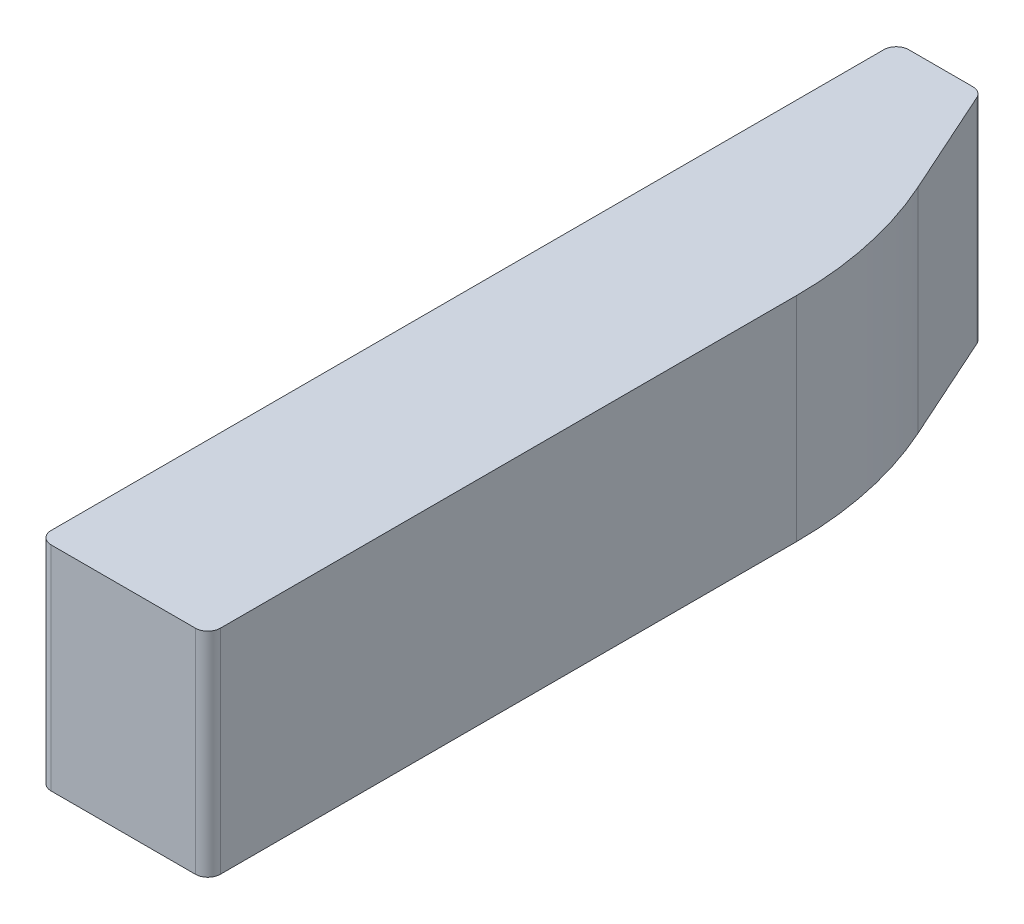
ISO-10303-21;
HEADER;
FILE_DESCRIPTION(('STEP AP214'),'2;1');
FILE_NAME('part.step','',(''),(''),'','','');
FILE_SCHEMA(('AUTOMOTIVE_DESIGN { 1 0 10303 214 1 1 1 1 }'));
ENDSEC;
DATA;
#1=APPLICATION_CONTEXT('core data for automotive mechanical design processes');
#2=APPLICATION_PROTOCOL_DEFINITION('international standard','automotive_design',2000,#1);
#3=PRODUCT_CONTEXT('',#1,'mechanical');
#4=PRODUCT('Part','Part','',(#3));
#5=PRODUCT_RELATED_PRODUCT_CATEGORY('part','',(#4));
#6=PRODUCT_DEFINITION_FORMATION('','',#4);
#7=PRODUCT_DEFINITION_CONTEXT('part definition',#1,'design');
#8=PRODUCT_DEFINITION('design','',#6,#7);
#9=PRODUCT_DEFINITION_SHAPE('','',#8);
#10=(LENGTH_UNIT() NAMED_UNIT(*) SI_UNIT(.MILLI.,.METRE.));
#11=(NAMED_UNIT(*) PLANE_ANGLE_UNIT() SI_UNIT($,.RADIAN.));
#12=(NAMED_UNIT(*) SI_UNIT($,.STERADIAN.) SOLID_ANGLE_UNIT());
#13=UNCERTAINTY_MEASURE_WITH_UNIT(LENGTH_MEASURE(1.E-05),#10,'distance_accuracy_value','');
#14=(GEOMETRIC_REPRESENTATION_CONTEXT(3) GLOBAL_UNCERTAINTY_ASSIGNED_CONTEXT((#13)) GLOBAL_UNIT_ASSIGNED_CONTEXT((#10,
#11,#12)) REPRESENTATION_CONTEXT('',''));
#15=CARTESIAN_POINT('',(0.,0.,0.));
#16=DIRECTION('',(0.,0.,1.));
#17=DIRECTION('',(1.,0.,0.));
#18=AXIS2_PLACEMENT_3D('',#15,#16,#17);
#19=CARTESIAN_POINT('',(-20.,17.,0.));
#20=DIRECTION('',(-1.,0.,0.));
#21=DIRECTION('',(0.,0.,-1.));
#22=AXIS2_PLACEMENT_3D('',#19,#20,#21);
#23=PLANE('',#22);
#24=DIRECTION('',(0.,0.,1.));
#25=VECTOR('',#24,1.);
#26=CARTESIAN_POINT('',(-20.,0.,0.));
#27=LINE('',#26,#25);
#28=CARTESIAN_POINT('',(-20.,0.,-46.960959335129));
#29=VERTEX_POINT('',#28);
#30=CARTESIAN_POINT('',(-20.,0.,-1.));
#31=VERTEX_POINT('',#30);
#32=EDGE_CURVE('E186',#29,#31,#27,.T.);
#33=ORIENTED_EDGE('',*,*,#32,.F.);
#34=DIRECTION('',(0.,1.,0.));
#35=VECTOR('',#34,1.);
#36=CARTESIAN_POINT('',(-20.,17.,-46.960959335129));
#37=LINE('',#36,#35);
#38=CARTESIAN_POINT('',(-20.,17.,-46.960959335129));
#39=VERTEX_POINT('',#38);
#40=EDGE_CURVE('E132',#39,#29,#37,.F.);
#41=ORIENTED_EDGE('',*,*,#40,.F.);
#42=DIRECTION('',(0.,0.,1.));
#43=VECTOR('',#42,1.);
#44=CARTESIAN_POINT('',(-20.,17.,0.));
#45=LINE('',#44,#43);
#46=CARTESIAN_POINT('',(-20.,17.,-1.));
#47=VERTEX_POINT('',#46);
#48=EDGE_CURVE('E130',#39,#47,#45,.T.);
#49=ORIENTED_EDGE('',*,*,#48,.T.);
#50=DIRECTION('',(0.,-1.,0.));
#51=VECTOR('',#50,1.);
#52=CARTESIAN_POINT('',(-20.,17.,-1.));
#53=LINE('',#52,#51);
#54=EDGE_CURVE('E152',#31,#47,#53,.F.);
#55=ORIENTED_EDGE('',*,*,#54,.F.);
#56=EDGE_LOOP('',(#33,#41,#49,#55));
#57=FACE_BOUND('',#56,.T.);
#58=ADVANCED_FACE('F33',(#57),#23,.F.);
#59=CARTESIAN_POINT('',(-20.,17.,0.));
#60=DIRECTION('',(0.,0.,-1.));
#61=DIRECTION('',(1.,0.,0.));
#62=AXIS2_PLACEMENT_3D('',#59,#60,#61);
#63=PLANE('',#62);
#64=DIRECTION('',(-1.,0.,0.));
#65=VECTOR('',#64,1.);
#66=CARTESIAN_POINT('',(-20.,17.,0.));
#67=LINE('',#66,#65);
#68=CARTESIAN_POINT('',(-21.,17.,0.));
#69=VERTEX_POINT('',#68);
#70=CARTESIAN_POINT('',(-32.5,17.,0.));
#71=VERTEX_POINT('',#70);
#72=EDGE_CURVE('E179',#69,#71,#67,.T.);
#73=ORIENTED_EDGE('',*,*,#72,.T.);
#74=DIRECTION('',(0.,-1.,0.));
#75=VECTOR('',#74,1.);
#76=CARTESIAN_POINT('',(-32.5,17.,0.));
#77=LINE('',#76,#75);
#78=CARTESIAN_POINT('',(-32.5,0.,0.));
#79=VERTEX_POINT('',#78);
#80=EDGE_CURVE('E138',#79,#71,#77,.F.);
#81=ORIENTED_EDGE('',*,*,#80,.F.);
#82=DIRECTION('',(-1.,0.,0.));
#83=VECTOR('',#82,1.);
#84=CARTESIAN_POINT('',(-20.,0.,0.));
#85=LINE('',#84,#83);
#86=CARTESIAN_POINT('',(-21.,0.,0.));
#87=VERTEX_POINT('',#86);
#88=EDGE_CURVE('E181',#87,#79,#85,.T.);
#89=ORIENTED_EDGE('',*,*,#88,.F.);
#90=DIRECTION('',(0.,-1.,0.));
#91=VECTOR('',#90,1.);
#92=CARTESIAN_POINT('',(-21.,17.,0.));
#93=LINE('',#92,#91);
#94=EDGE_CURVE('E141',#69,#87,#93,.T.);
#95=ORIENTED_EDGE('',*,*,#94,.F.);
#96=EDGE_LOOP('',(#73,#81,#89,#95));
#97=FACE_BOUND('',#96,.T.);
#98=ADVANCED_FACE('F222',(#97),#63,.F.);
#99=CARTESIAN_POINT('',(-33.5,17.,0.));
#100=DIRECTION('',(1.,0.,0.));
#101=DIRECTION('',(0.,0.,1.));
#102=AXIS2_PLACEMENT_3D('',#99,#100,#101);
#103=PLANE('',#102);
#104=DIRECTION('',(0.,0.,-1.));
#105=VECTOR('',#104,1.);
#106=CARTESIAN_POINT('',(-33.5,17.,0.));
#107=LINE('',#106,#105);
#108=CARTESIAN_POINT('',(-33.5,17.,-1.));
#109=VERTEX_POINT('',#108);
#110=CARTESIAN_POINT('',(-33.5,17.,-67.4));
#111=VERTEX_POINT('',#110);
#112=EDGE_CURVE('E191',#109,#111,#107,.T.);
#113=ORIENTED_EDGE('',*,*,#112,.T.);
#114=DIRECTION('',(0.,-1.,0.));
#115=VECTOR('',#114,1.);
#116=CARTESIAN_POINT('',(-33.5,17.,-67.4));
#117=LINE('',#116,#115);
#118=CARTESIAN_POINT('',(-33.5,0.,-67.4));
#119=VERTEX_POINT('',#118);
#120=EDGE_CURVE('E161',#119,#111,#117,.F.);
#121=ORIENTED_EDGE('',*,*,#120,.F.);
#122=DIRECTION('',(0.,0.,-1.));
#123=VECTOR('',#122,1.);
#124=CARTESIAN_POINT('',(-33.5,0.,0.));
#125=LINE('',#124,#123);
#126=CARTESIAN_POINT('',(-33.5,0.,-1.));
#127=VERTEX_POINT('',#126);
#128=EDGE_CURVE('E178',#127,#119,#125,.T.);
#129=ORIENTED_EDGE('',*,*,#128,.F.);
#130=DIRECTION('',(0.,-1.,0.));
#131=VECTOR('',#130,1.);
#132=CARTESIAN_POINT('',(-33.5,17.,-1.));
#133=LINE('',#132,#131);
#134=EDGE_CURVE('E163',#109,#127,#133,.T.);
#135=ORIENTED_EDGE('',*,*,#134,.F.);
#136=EDGE_LOOP('',(#113,#121,#129,#135));
#137=FACE_BOUND('',#136,.T.);
#138=ADVANCED_FACE('F215',(#137),#103,.F.);
#139=CARTESIAN_POINT('',(-20.,17.,-68.4));
#140=DIRECTION('',(0.,0.,1.));
#141=DIRECTION('',(-1.,0.,0.));
#142=AXIS2_PLACEMENT_3D('',#139,#140,#141);
#143=PLANE('',#142);
#144=DIRECTION('',(1.,0.,0.));
#145=VECTOR('',#144,1.);
#146=CARTESIAN_POINT('',(-20.,17.,-68.4));
#147=LINE('',#146,#145);
#148=CARTESIAN_POINT('',(-32.5,17.,-68.4));
#149=VERTEX_POINT('',#148);
#150=CARTESIAN_POINT('',(-27.3965856099731,17.,-68.4));
#151=VERTEX_POINT('',#150);
#152=EDGE_CURVE('E122',#149,#151,#147,.T.);
#153=ORIENTED_EDGE('',*,*,#152,.T.);
#154=DIRECTION('',(0.,1.,0.));
#155=VECTOR('',#154,1.);
#156=CARTESIAN_POINT('',(-27.3965856099731,17.,-68.4));
#157=LINE('',#156,#155);
#158=CARTESIAN_POINT('',(-27.3965856099731,0.,-68.4));
#159=VERTEX_POINT('',#158);
#160=EDGE_CURVE('E166',#159,#151,#157,.T.);
#161=ORIENTED_EDGE('',*,*,#160,.F.);
#162=DIRECTION('',(1.,0.,0.));
#163=VECTOR('',#162,1.);
#164=CARTESIAN_POINT('',(-20.,0.,-68.4));
#165=LINE('',#164,#163);
#166=CARTESIAN_POINT('',(-32.5,0.,-68.4));
#167=VERTEX_POINT('',#166);
#168=EDGE_CURVE('E174',#167,#159,#165,.T.);
#169=ORIENTED_EDGE('',*,*,#168,.F.);
#170=DIRECTION('',(0.,-1.,0.));
#171=VECTOR('',#170,1.);
#172=CARTESIAN_POINT('',(-32.5,17.,-68.4));
#173=LINE('',#172,#171);
#174=EDGE_CURVE('E41',#149,#167,#173,.T.);
#175=ORIENTED_EDGE('',*,*,#174,.F.);
#176=EDGE_LOOP('',(#153,#161,#169,#175));
#177=FACE_BOUND('',#176,.T.);
#178=ADVANCED_FACE('F175',(#177),#143,.F.);
#179=CARTESIAN_POINT('',(-20.,17.,0.));
#180=DIRECTION('',(0.,-1.,0.));
#181=DIRECTION('',(0.,0.,-1.));
#182=AXIS2_PLACEMENT_3D('',#179,#180,#181);
#183=PLANE('',#182);
#184=ORIENTED_EDGE('',*,*,#48,.F.);
#185=CARTESIAN_POINT('',(-50.,17.,-46.960959335129));
#186=DIRECTION('',(0.,1.,0.));
#187=DIRECTION('',(0.,0.,-1.));
#188=AXIS2_PLACEMENT_3D('',#185,#186,#187);
#189=CIRCLE('',#188,30.);
#190=CARTESIAN_POINT('',(-22.6423548447468,17.,-59.2718996549929));
#191=VERTEX_POINT('',#190);
#192=EDGE_CURVE('E116',#191,#39,#189,.F.);
#193=ORIENTED_EDGE('',*,*,#192,.F.);
#194=DIRECTION('',(-0.410364677328798,0.,-0.911921505175107));
#195=VECTOR('',#194,1.);
#196=CARTESIAN_POINT('',(-20.,17.,-53.4));
#197=LINE('',#196,#195);
#198=CARTESIAN_POINT('',(-26.484664104798,17.,-67.8103646773288));
#199=VERTEX_POINT('',#198);
#200=EDGE_CURVE('E124',#191,#199,#197,.T.);
#201=ORIENTED_EDGE('',*,*,#200,.T.);
#202=CARTESIAN_POINT('',(-27.3965856099731,17.,-67.4));
#203=DIRECTION('',(0.,1.,0.));
#204=DIRECTION('',(0.,0.,-1.));
#205=AXIS2_PLACEMENT_3D('',#202,#203,#204);
#206=CIRCLE('',#205,1.);
#207=EDGE_CURVE('E48',#151,#199,#206,.F.);
#208=ORIENTED_EDGE('',*,*,#207,.F.);
#209=ORIENTED_EDGE('',*,*,#152,.F.);
#210=CARTESIAN_POINT('',(-32.5,17.,-67.4));
#211=DIRECTION('',(0.,1.,0.));
#212=DIRECTION('',(0.,0.,-1.));
#213=AXIS2_PLACEMENT_3D('',#210,#211,#212);
#214=CIRCLE('',#213,1.);
#215=EDGE_CURVE('E56',#111,#149,#214,.F.);
#216=ORIENTED_EDGE('',*,*,#215,.F.);
#217=ORIENTED_EDGE('',*,*,#112,.F.);
#218=CARTESIAN_POINT('',(-32.5,17.,-1.));
#219=DIRECTION('',(0.,1.,0.));
#220=DIRECTION('',(0.,0.,-1.));
#221=AXIS2_PLACEMENT_3D('',#218,#219,#220);
#222=CIRCLE('',#221,1.);
#223=EDGE_CURVE('E157',#71,#109,#222,.F.);
#224=ORIENTED_EDGE('',*,*,#223,.F.);
#225=ORIENTED_EDGE('',*,*,#72,.F.);
#226=CARTESIAN_POINT('',(-21.,17.,-1.));
#227=DIRECTION('',(0.,1.,0.));
#228=DIRECTION('',(0.,0.,-1.));
#229=AXIS2_PLACEMENT_3D('',#226,#227,#228);
#230=CIRCLE('',#229,1.);
#231=EDGE_CURVE('E159',#47,#69,#230,.F.);
#232=ORIENTED_EDGE('',*,*,#231,.F.);
#233=EDGE_LOOP('',(#184,#193,#201,#208,#209,#216,#217,#224,#225,#232));
#234=FACE_BOUND('',#233,.T.);
#235=ADVANCED_FACE('F128',(#234),#183,.F.);
#236=CARTESIAN_POINT('',(-20.,0.,0.));
#237=DIRECTION('',(0.,-1.,0.));
#238=DIRECTION('',(0.,0.,-1.));
#239=AXIS2_PLACEMENT_3D('',#236,#237,#238);
#240=PLANE('',#239);
#241=ORIENTED_EDGE('',*,*,#88,.T.);
#242=CARTESIAN_POINT('',(-32.5,0.,-1.));
#243=DIRECTION('',(0.,1.,0.));
#244=DIRECTION('',(0.,0.,-1.));
#245=AXIS2_PLACEMENT_3D('',#242,#243,#244);
#246=CIRCLE('',#245,1.);
#247=EDGE_CURVE('E148',#127,#79,#246,.T.);
#248=ORIENTED_EDGE('',*,*,#247,.F.);
#249=ORIENTED_EDGE('',*,*,#128,.T.);
#250=CARTESIAN_POINT('',(-32.5,0.,-67.4));
#251=DIRECTION('',(0.,1.,0.));
#252=DIRECTION('',(0.,0.,-1.));
#253=AXIS2_PLACEMENT_3D('',#250,#251,#252);
#254=CIRCLE('',#253,1.);
#255=EDGE_CURVE('E146',#167,#119,#254,.T.);
#256=ORIENTED_EDGE('',*,*,#255,.F.);
#257=ORIENTED_EDGE('',*,*,#168,.T.);
#258=CARTESIAN_POINT('',(-27.3965856099731,0.,-67.4));
#259=DIRECTION('',(0.,1.,0.));
#260=DIRECTION('',(0.,0.,-1.));
#261=AXIS2_PLACEMENT_3D('',#258,#259,#260);
#262=CIRCLE('',#261,1.);
#263=CARTESIAN_POINT('',(-26.484664104798,0.,-67.8103646773288));
#264=VERTEX_POINT('',#263);
#265=EDGE_CURVE('E144',#264,#159,#262,.T.);
#266=ORIENTED_EDGE('',*,*,#265,.F.);
#267=DIRECTION('',(-0.410364677328798,0.,-0.911921505175107));
#268=VECTOR('',#267,1.);
#269=CARTESIAN_POINT('',(-20.,0.,-53.4));
#270=LINE('',#269,#268);
#271=CARTESIAN_POINT('',(-22.6423548447468,0.,-59.2718996549929));
#272=VERTEX_POINT('',#271);
#273=EDGE_CURVE('E126',#272,#264,#270,.T.);
#274=ORIENTED_EDGE('',*,*,#273,.F.);
#275=CARTESIAN_POINT('',(-50.,0.,-46.960959335129));
#276=DIRECTION('',(0.,1.,0.));
#277=DIRECTION('',(0.,0.,-1.));
#278=AXIS2_PLACEMENT_3D('',#275,#276,#277);
#279=CIRCLE('',#278,30.);
#280=EDGE_CURVE('E118',#29,#272,#279,.T.);
#281=ORIENTED_EDGE('',*,*,#280,.F.);
#282=ORIENTED_EDGE('',*,*,#32,.T.);
#283=CARTESIAN_POINT('',(-21.,0.,-1.));
#284=DIRECTION('',(0.,1.,0.));
#285=DIRECTION('',(0.,0.,-1.));
#286=AXIS2_PLACEMENT_3D('',#283,#284,#285);
#287=CIRCLE('',#286,1.);
#288=EDGE_CURVE('E150',#87,#31,#287,.T.);
#289=ORIENTED_EDGE('',*,*,#288,.F.);
#290=EDGE_LOOP('',(#241,#248,#249,#256,#257,#266,#274,#281,#282,#289));
#291=FACE_BOUND('',#290,.T.);
#292=CARTESIAN_POINT('',(-28.5,0.,-47.4));
#293=DIRECTION('',(0.,1.,0.));
#294=DIRECTION('',(0.,0.,-1.));
#295=AXIS2_PLACEMENT_3D('',#292,#293,#294);
#296=CIRCLE('',#295,2.75);
#297=CARTESIAN_POINT('',(-28.5,0.,-50.15));
#298=VERTEX_POINT('',#297);
#299=EDGE_CURVE('E202',#298,#298,#296,.T.);
#300=ORIENTED_EDGE('',*,*,#299,.T.);
#301=EDGE_LOOP('',(#300));
#302=FACE_BOUND('',#301,.T.);
#303=CARTESIAN_POINT('',(-28.5,0.,-11.));
#304=DIRECTION('',(0.,1.,0.));
#305=DIRECTION('',(0.,0.,1.));
#306=AXIS2_PLACEMENT_3D('',#303,#304,#305);
#307=CIRCLE('',#306,2.75);
#308=CARTESIAN_POINT('',(-28.5,0.,-8.25));
#309=VERTEX_POINT('',#308);
#310=EDGE_CURVE('E196',#309,#309,#307,.T.);
#311=ORIENTED_EDGE('',*,*,#310,.T.);
#312=EDGE_LOOP('',(#311));
#313=FACE_BOUND('',#312,.T.);
#314=ADVANCED_FACE('F207',(#291,#302,#313),#240,.T.);
#315=CARTESIAN_POINT('',(-28.5,5.,-11.));
#316=DIRECTION('',(0.,-1.,0.));
#317=DIRECTION('',(0.,0.,-1.));
#318=AXIS2_PLACEMENT_3D('',#315,#316,#317);
#319=CYLINDRICAL_SURFACE('',#318,2.75);
#320=CARTESIAN_POINT('',(-28.5,5.,-11.));
#321=DIRECTION('',(0.,1.,0.));
#322=DIRECTION('',(0.,0.,1.));
#323=AXIS2_PLACEMENT_3D('',#320,#321,#322);
#324=CIRCLE('',#323,2.75);
#325=CARTESIAN_POINT('',(-28.5,5.,-8.25));
#326=VERTEX_POINT('',#325);
#327=EDGE_CURVE('E199',#326,#326,#324,.T.);
#328=ORIENTED_EDGE('',*,*,#327,.T.);
#329=EDGE_LOOP('',(#328));
#330=FACE_BOUND('',#329,.T.);
#331=ORIENTED_EDGE('',*,*,#310,.F.);
#332=EDGE_LOOP('',(#331));
#333=FACE_BOUND('',#332,.T.);
#334=ADVANCED_FACE('F308',(#330,#333),#319,.F.);
#335=CARTESIAN_POINT('',(-28.5,5.,-11.));
#336=DIRECTION('',(0.,1.,0.));
#337=DIRECTION('',(0.,0.,1.));
#338=AXIS2_PLACEMENT_3D('',#335,#336,#337);
#339=PLANE('',#338);
#340=ORIENTED_EDGE('',*,*,#327,.F.);
#341=EDGE_LOOP('',(#340));
#342=FACE_BOUND('',#341,.T.);
#343=ADVANCED_FACE('F298',(#342),#339,.F.);
#344=CARTESIAN_POINT('',(-28.5,5.,-47.4));
#345=DIRECTION('',(0.,-1.,0.));
#346=DIRECTION('',(0.,0.,-1.));
#347=AXIS2_PLACEMENT_3D('',#344,#345,#346);
#348=CYLINDRICAL_SURFACE('',#347,2.75);
#349=CARTESIAN_POINT('',(-28.5,5.,-47.4));
#350=DIRECTION('',(0.,1.,0.));
#351=DIRECTION('',(0.,0.,-1.));
#352=AXIS2_PLACEMENT_3D('',#349,#350,#351);
#353=CIRCLE('',#352,2.75);
#354=CARTESIAN_POINT('',(-28.5,5.,-50.15));
#355=VERTEX_POINT('',#354);
#356=EDGE_CURVE('E189',#355,#355,#353,.T.);
#357=ORIENTED_EDGE('',*,*,#356,.T.);
#358=EDGE_LOOP('',(#357));
#359=FACE_BOUND('',#358,.T.);
#360=ORIENTED_EDGE('',*,*,#299,.F.);
#361=EDGE_LOOP('',(#360));
#362=FACE_BOUND('',#361,.T.);
#363=ADVANCED_FACE('F288',(#359,#362),#348,.F.);
#364=CARTESIAN_POINT('',(-28.5,5.,-47.4));
#365=DIRECTION('',(0.,-1.,0.));
#366=DIRECTION('',(0.,0.,-1.));
#367=AXIS2_PLACEMENT_3D('',#364,#365,#366);
#368=PLANE('',#367);
#369=ORIENTED_EDGE('',*,*,#356,.F.);
#370=EDGE_LOOP('',(#369));
#371=FACE_BOUND('',#370,.T.);
#372=ADVANCED_FACE('F279',(#371),#368,.T.);
#373=CARTESIAN_POINT('',(-20.,-16.448784149596,-53.4));
#374=DIRECTION('',(-0.911921505175106,0.,0.410364677328798));
#375=DIRECTION('',(-0.410364677328798,0.,-0.911921505175107));
#376=AXIS2_PLACEMENT_3D('',#373,#374,#375);
#377=PLANE('',#376);
#378=ORIENTED_EDGE('',*,*,#200,.F.);
#379=DIRECTION('',(0.,1.,0.));
#380=VECTOR('',#379,1.);
#381=CARTESIAN_POINT('',(-22.6423548447468,-16.448784149596,-59.2718996549929));
#382=LINE('',#381,#380);
#383=EDGE_CURVE('E111',#272,#191,#382,.T.);
#384=ORIENTED_EDGE('',*,*,#383,.F.);
#385=ORIENTED_EDGE('',*,*,#273,.T.);
#386=DIRECTION('',(0.,1.,0.));
#387=VECTOR('',#386,1.);
#388=CARTESIAN_POINT('',(-26.484664104798,-16.448784149596,-67.8103646773288));
#389=LINE('',#388,#387);
#390=EDGE_CURVE('E11',#199,#264,#389,.F.);
#391=ORIENTED_EDGE('',*,*,#390,.F.);
#392=EDGE_LOOP('',(#378,#384,#385,#391));
#393=FACE_BOUND('',#392,.T.);
#394=ADVANCED_FACE('F125',(#393),#377,.F.);
#395=CARTESIAN_POINT('',(-50.,-16.448784149596,-46.960959335129));
#396=DIRECTION('',(0.,1.,0.));
#397=DIRECTION('',(0.,0.,1.));
#398=AXIS2_PLACEMENT_3D('',#395,#396,#397);
#399=CYLINDRICAL_SURFACE('',#398,30.);
#400=ORIENTED_EDGE('',*,*,#280,.T.);
#401=ORIENTED_EDGE('',*,*,#383,.T.);
#402=ORIENTED_EDGE('',*,*,#192,.T.);
#403=ORIENTED_EDGE('',*,*,#40,.T.);
#404=EDGE_LOOP('',(#400,#401,#402,#403));
#405=FACE_BOUND('',#404,.T.);
#406=ADVANCED_FACE('F113',(#405),#399,.T.);
#407=CARTESIAN_POINT('',(-21.,17.,-1.));
#408=DIRECTION('',(0.,-1.,0.));
#409=DIRECTION('',(0.,0.,-1.));
#410=AXIS2_PLACEMENT_3D('',#407,#408,#409);
#411=CYLINDRICAL_SURFACE('',#410,1.);
#412=ORIENTED_EDGE('',*,*,#231,.T.);
#413=ORIENTED_EDGE('',*,*,#94,.T.);
#414=ORIENTED_EDGE('',*,*,#288,.T.);
#415=ORIENTED_EDGE('',*,*,#54,.T.);
#416=EDGE_LOOP('',(#412,#413,#414,#415));
#417=FACE_BOUND('',#416,.T.);
#418=ADVANCED_FACE('F225',(#417),#411,.T.);
#419=CARTESIAN_POINT('',(-32.5,17.,-1.));
#420=DIRECTION('',(0.,-1.,0.));
#421=DIRECTION('',(0.,0.,-1.));
#422=AXIS2_PLACEMENT_3D('',#419,#420,#421);
#423=CYLINDRICAL_SURFACE('',#422,1.);
#424=ORIENTED_EDGE('',*,*,#223,.T.);
#425=ORIENTED_EDGE('',*,*,#134,.T.);
#426=ORIENTED_EDGE('',*,*,#247,.T.);
#427=ORIENTED_EDGE('',*,*,#80,.T.);
#428=EDGE_LOOP('',(#424,#425,#426,#427));
#429=FACE_BOUND('',#428,.T.);
#430=ADVANCED_FACE('F217',(#429),#423,.T.);
#431=CARTESIAN_POINT('',(-32.5,17.,-67.4));
#432=DIRECTION('',(0.,-1.,0.));
#433=DIRECTION('',(0.,0.,-1.));
#434=AXIS2_PLACEMENT_3D('',#431,#432,#433);
#435=CYLINDRICAL_SURFACE('',#434,1.);
#436=ORIENTED_EDGE('',*,*,#215,.T.);
#437=ORIENTED_EDGE('',*,*,#174,.T.);
#438=ORIENTED_EDGE('',*,*,#255,.T.);
#439=ORIENTED_EDGE('',*,*,#120,.T.);
#440=EDGE_LOOP('',(#436,#437,#438,#439));
#441=FACE_BOUND('',#440,.T.);
#442=ADVANCED_FACE('F168',(#441),#435,.T.);
#443=CARTESIAN_POINT('',(-27.3965856099731,17.,-67.4));
#444=DIRECTION('',(0.,1.,0.));
#445=DIRECTION('',(0.,0.,1.));
#446=AXIS2_PLACEMENT_3D('',#443,#444,#445);
#447=CYLINDRICAL_SURFACE('',#446,1.);
#448=ORIENTED_EDGE('',*,*,#265,.T.);
#449=ORIENTED_EDGE('',*,*,#160,.T.);
#450=ORIENTED_EDGE('',*,*,#207,.T.);
#451=ORIENTED_EDGE('',*,*,#390,.T.);
#452=EDGE_LOOP('',(#448,#449,#450,#451));
#453=FACE_BOUND('',#452,.T.);
#454=ADVANCED_FACE('F35',(#453),#447,.T.);
#455=CLOSED_SHELL('',(#58,#98,#138,#178,#235,#314,#334,#343,#363,#372,#394,#406,#418,#430,#442,#454));
#456=MANIFOLD_SOLID_BREP('B2',#455);
#457=ADVANCED_BREP_SHAPE_REPRESENTATION('',(#18,#456),#14);
#458=SHAPE_DEFINITION_REPRESENTATION(#9,#457);
ENDSEC;
END-ISO-10303-21;
